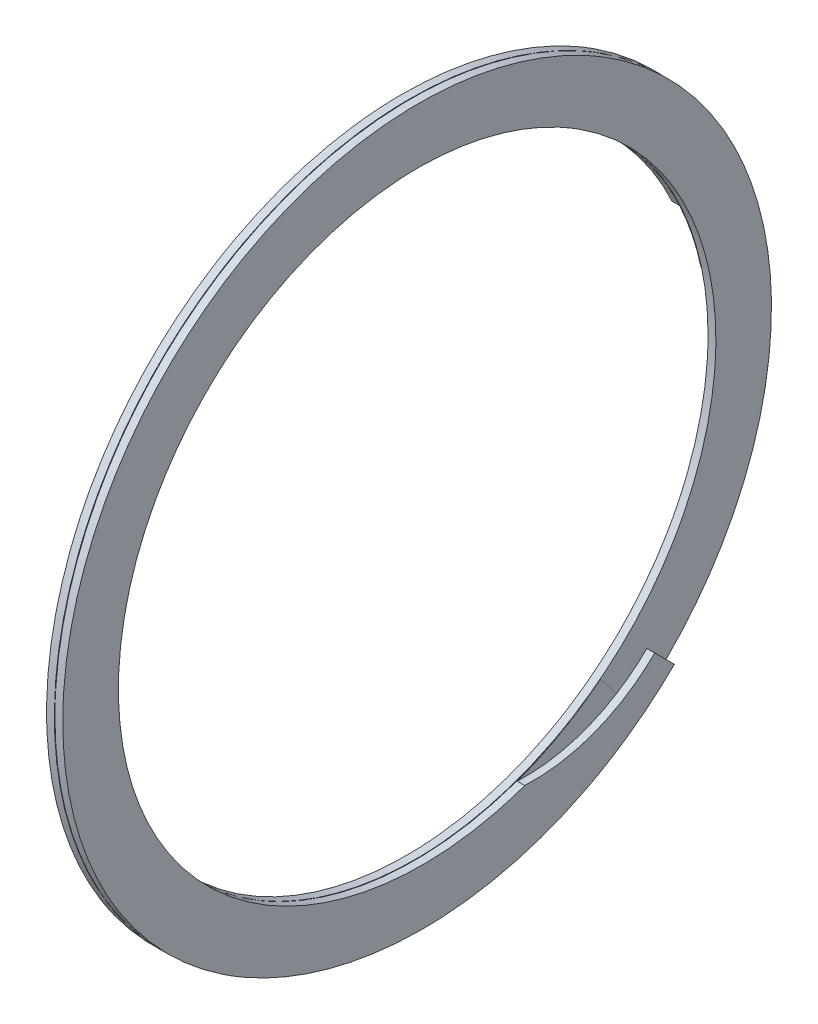
ISO-10303-21;
HEADER;
FILE_DESCRIPTION(('STEP AP214'),'2;1');
FILE_NAME('part.step','',(''),(''),'','','');
FILE_SCHEMA(('AUTOMOTIVE_DESIGN { 1 0 10303 214 1 1 1 1 }'));
ENDSEC;
DATA;
#1=APPLICATION_CONTEXT('core data for automotive mechanical design processes');
#2=APPLICATION_PROTOCOL_DEFINITION('international standard','automotive_design',2000,#1);
#3=PRODUCT_CONTEXT('',#1,'mechanical');
#4=PRODUCT('Part','Part','',(#3));
#5=PRODUCT_RELATED_PRODUCT_CATEGORY('part','',(#4));
#6=PRODUCT_DEFINITION_FORMATION('','',#4);
#7=PRODUCT_DEFINITION_CONTEXT('part definition',#1,'design');
#8=PRODUCT_DEFINITION('design','',#6,#7);
#9=PRODUCT_DEFINITION_SHAPE('','',#8);
#10=(LENGTH_UNIT() NAMED_UNIT(*) SI_UNIT(.MILLI.,.METRE.));
#11=(NAMED_UNIT(*) PLANE_ANGLE_UNIT() SI_UNIT($,.RADIAN.));
#12=(NAMED_UNIT(*) SI_UNIT($,.STERADIAN.) SOLID_ANGLE_UNIT());
#13=UNCERTAINTY_MEASURE_WITH_UNIT(LENGTH_MEASURE(1.E-05),#10,'distance_accuracy_value','');
#14=(GEOMETRIC_REPRESENTATION_CONTEXT(3) GLOBAL_UNCERTAINTY_ASSIGNED_CONTEXT((#13)) GLOBAL_UNIT_ASSIGNED_CONTEXT((#10,
#11,#12)) REPRESENTATION_CONTEXT('',''));
#15=CARTESIAN_POINT('',(0.,0.,0.));
#16=DIRECTION('',(0.,0.,1.));
#17=DIRECTION('',(1.,0.,0.));
#18=AXIS2_PLACEMENT_3D('',#15,#16,#17);
#19=CARTESIAN_POINT('',(0.423333333333334,0.,-16.2179));
#20=DIRECTION('',(0.,-1.,0.));
#21=DIRECTION('',(0.,0.,-1.));
#22=AXIS2_PLACEMENT_3D('',#19,#20,#21);
#23=PLANE('',#22);
#24=DIRECTION('',(0.,0.,-1.));
#25=VECTOR('',#24,1.);
#26=CARTESIAN_POINT('',(0.423333333333333,0.,-19.2151));
#27=LINE('',#26,#25);
#28=CARTESIAN_POINT('',(0.423333333333334,0.,-17.7165));
#29=VERTEX_POINT('',#28);
#30=CARTESIAN_POINT('',(0.423333333333333,0.,-19.2151));
#31=VERTEX_POINT('',#30);
#32=EDGE_CURVE('E275',#29,#31,#27,.T.);
#33=ORIENTED_EDGE('',*,*,#32,.F.);
#34=DIRECTION('',(-1.,0.,0.));
#35=VECTOR('',#34,1.);
#36=CARTESIAN_POINT('',(0.437444779966142,0.,-17.7165));
#37=LINE('',#36,#35);
#38=CARTESIAN_POINT('',(0.,0.,-17.7165));
#39=VERTEX_POINT('',#38);
#40=EDGE_CURVE('E193',#29,#39,#37,.T.);
#41=ORIENTED_EDGE('',*,*,#40,.T.);
#42=DIRECTION('',(0.,0.,1.));
#43=VECTOR('',#42,1.);
#44=CARTESIAN_POINT('',(0.,0.,-19.2151));
#45=LINE('',#44,#43);
#46=CARTESIAN_POINT('',(0.,0.,-19.2151));
#47=VERTEX_POINT('',#46);
#48=EDGE_CURVE('E272',#47,#39,#45,.T.);
#49=ORIENTED_EDGE('',*,*,#48,.F.);
#50=DIRECTION('',(-1.,0.,0.));
#51=VECTOR('',#50,1.);
#52=CARTESIAN_POINT('',(0.423333333333333,0.,-19.2151));
#53=LINE('',#52,#51);
#54=EDGE_CURVE('E289',#31,#47,#53,.T.);
#55=ORIENTED_EDGE('',*,*,#54,.F.);
#56=EDGE_LOOP('',(#33,#41,#49,#55));
#57=FACE_BOUND('',#56,.T.);
#58=ADVANCED_FACE('F39',(#57),#23,.T.);
#59=CARTESIAN_POINT('',(0.,0.,-19.2151));
#60=CARTESIAN_POINT('',(0.0376296296296295,11.0938431575056,-19.2151));
#61=CARTESIAN_POINT('',(0.0752592592592591,16.6407647362584,-9.60755));
#62=CARTESIAN_POINT('',(0.112888888888889,22.1876863150112,0.));
#63=CARTESIAN_POINT('',(0.150518518518518,16.6407647362584,9.60755));
#64=CARTESIAN_POINT('',(0.188148148148148,11.0938431575056,19.2151));
#65=CARTESIAN_POINT('',(0.225777777777777,0.,19.2151));
#66=CARTESIAN_POINT('',(0.263407407407407,-11.0938431575056,19.2151));
#67=CARTESIAN_POINT('',(0.301037037037036,-16.6407647362584,9.60755000000001));
#68=CARTESIAN_POINT('',(0.338666666666666,-22.1876863150112,0.));
#69=CARTESIAN_POINT('',(0.376296296296295,-16.6407647362584,-9.60754999999999));
#70=CARTESIAN_POINT('',(0.413925925925925,-11.0938431575056,-19.2151));
#71=CARTESIAN_POINT('',(0.451555555555555,0.,-19.2151));
#72=CARTESIAN_POINT('',(0.489185185185184,11.0938431575056,-19.2151));
#73=CARTESIAN_POINT('',(0.526814814814814,16.6407647362584,-9.60755));
#74=CARTESIAN_POINT('',(0.564444444444443,22.1876863150112,0.));
#75=CARTESIAN_POINT('',(0.602074074074073,16.6407647362584,9.60755));
#76=CARTESIAN_POINT('',(0.639703703703702,11.0938431575056,19.2151));
#77=CARTESIAN_POINT('',(0.677333333333332,0.,19.2151));
#78=CARTESIAN_POINT('',(0.714962962962961,-11.0938431575056,19.2151));
#79=CARTESIAN_POINT('',(0.752592592592591,-16.6407647362584,9.60755000000001));
#80=CARTESIAN_POINT('',(0.790222222222221,-22.1876863150112,0.));
#81=CARTESIAN_POINT('',(0.82785185185185,-16.6407647362584,-9.60754999999999));
#82=CARTESIAN_POINT('',(0.86548148148148,-11.0938431575056,-19.2151));
#83=CARTESIAN_POINT('',(0.903111111111109,0.,-19.2151));
#84=CARTESIAN_POINT('',(0.,0.,-16.2179));
#85=CARTESIAN_POINT('',(0.0376296296296295,9.36340893069043,-16.2179));
#86=CARTESIAN_POINT('',(0.0752592592592591,14.0451133960356,-8.10895));
#87=CARTESIAN_POINT('',(0.112888888888889,18.7268178613809,0.));
#88=CARTESIAN_POINT('',(0.150518518518518,14.0451133960356,8.10894999999999));
#89=CARTESIAN_POINT('',(0.188148148148148,9.36340893069044,16.2179));
#90=CARTESIAN_POINT('',(0.225777777777777,0.,16.2179));
#91=CARTESIAN_POINT('',(0.263407407407407,-9.36340893069042,16.2179));
#92=CARTESIAN_POINT('',(0.301037037037036,-14.0451133960356,8.10895000000001));
#93=CARTESIAN_POINT('',(0.338666666666666,-18.7268178613809,0.));
#94=CARTESIAN_POINT('',(0.376296296296295,-14.0451133960357,-8.10894999999999));
#95=CARTESIAN_POINT('',(0.413925925925925,-9.36340893069044,-16.2179));
#96=CARTESIAN_POINT('',(0.451555555555555,0.,-16.2179));
#97=CARTESIAN_POINT('',(0.489185185185184,9.36340893069043,-16.2179));
#98=CARTESIAN_POINT('',(0.526814814814814,14.0451133960356,-8.10895));
#99=CARTESIAN_POINT('',(0.564444444444443,18.7268178613809,0.));
#100=CARTESIAN_POINT('',(0.602074074074073,14.0451133960356,8.10894999999999));
#101=CARTESIAN_POINT('',(0.639703703703702,9.36340893069044,16.2179));
#102=CARTESIAN_POINT('',(0.677333333333332,0.,16.2179));
#103=CARTESIAN_POINT('',(0.714962962962961,-9.36340893069042,16.2179));
#104=CARTESIAN_POINT('',(0.752592592592591,-14.0451133960356,8.10895000000001));
#105=CARTESIAN_POINT('',(0.790222222222221,-18.7268178613809,0.));
#106=CARTESIAN_POINT('',(0.82785185185185,-14.0451133960357,-8.10894999999999));
#107=CARTESIAN_POINT('',(0.86548148148148,-9.36340893069044,-16.2179));
#108=CARTESIAN_POINT('',(0.903111111111109,0.,-16.2179));
#109=(BOUNDED_SURFACE() B_SPLINE_SURFACE(1,2,((#59,#60,#61,#62,#63,#64,#65,#66,#67,#68,#69,#70,
#71,#72,#73,#74,#75,#76,#77,#78,#79,#80,#81,#82,#83),(#84,#85,#86,#87,#88,#89,#90,#91,#92,#93,
#94,#95,#96,#97,#98,#99,#100,#101,#102,#103,#104,#105,#106,#107,#108)),.UNSPECIFIED.,.F.,.F.,
.F.) B_SPLINE_SURFACE_WITH_KNOTS((2,2),(3,2,2,2,2,2,2,2,2,2,2,2,3),(0.,1.),(0.,
0.0833333333333333,0.166666666666667,0.25,0.333333333333333,0.416666666666667,0.5,
0.583333333333333,0.666666666666667,0.75,0.833333333333333,0.916666666666667,1.),
.UNSPECIFIED.) GEOMETRIC_REPRESENTATION_ITEM() RATIONAL_B_SPLINE_SURFACE(((1.,0.866025403784439,
1.,0.866025403784439,1.,0.866025403784439,1.,0.866025403784439,1.,0.866025403784439,1.,
0.866025403784439,1.,0.866025403784439,1.,0.866025403784439,1.,0.866025403784439,1.,
0.866025403784439,1.,0.866025403784439,1.,0.866025403784439,1.),(1.,0.866025403784439,1.,
0.866025403784439,1.,0.866025403784439,1.,0.866025403784439,1.,0.866025403784439,1.,
0.866025403784439,1.,0.866025403784439,1.,0.866025403784439,1.,0.866025403784439,1.,
0.866025403784439,1.,0.866025403784439,1.,0.866025403784439,1.))) REPRESENTATION_ITEM('') SURFACE());
#110=CARTESIAN_POINT('',(0.846002954781843,-12.5274567862123,-12.5274577915705));
#111=CARTESIAN_POINT('',(0.845645095292089,-12.5891267223919,-12.4657883529428));
#112=CARTESIAN_POINT('',(0.845287943955112,-12.6499278812871,-12.403250169712));
#113=CARTESIAN_POINT('',(0.844575969344457,-12.7696042567872,-12.2766364372516));
#114=CARTESIAN_POINT('',(0.844221142566673,-12.8284836775949,-12.2125648618543));
#115=CARTESIAN_POINT('',(0.843513596701136,-12.9443283969132,-12.0828950856114));
#116=CARTESIAN_POINT('',(0.843160875176884,-13.0012965590127,-12.0172994430442));
#117=CARTESIAN_POINT('',(0.842457325935102,-13.1133266922086,-11.8845886721481));
#118=CARTESIAN_POINT('',(0.842106496943383,-13.1683901312167,-11.817474782984));
#119=CARTESIAN_POINT('',(0.841406522324876,-13.2766146758252,-11.6817303286152));
#120=CARTESIAN_POINT('',(0.84105737669809,-13.3297757814235,-11.613099763409));
#121=CARTESIAN_POINT('',(0.840360563315117,-13.4341951297367,-11.4743211316773));
#122=CARTESIAN_POINT('',(0.8400128969429,-13.48545183743,-11.4041719101637));
#123=CARTESIAN_POINT('',(0.839318843061387,-13.5860568556888,-11.2623519570958));
#124=CARTESIAN_POINT('',(0.838972458427607,-13.6354020343582,-11.1906790037916));
#125=CARTESIAN_POINT('',(0.838280772386356,-13.7321742471712,-11.0458044392397));
#126=CARTESIAN_POINT('',(0.837935475475736,-13.7795964707902,-10.9725996146416));
#127=CARTESIAN_POINT('',(0.837591167891047,-13.825978247133,-10.8987413649063));
#128=B_SPLINE_CURVE_WITH_KNOTS('',3,(#110,#111,#112,#113,#114,#115,#116,#117,#118,#119,#120,
#121,#122,#123,#124,#125,#126,#127),.UNSPECIFIED.,.F.,.F.,(4,2,2,2,2,2,2,2,4),(0.,
0.261635829936186,0.522654579689194,0.783262994303639,1.04366587627582,1.30406875852038,
1.56467717318963,1.82569592296043,2.08733175327831),.UNSPECIFIED.);
#129=CARTESIAN_POINT('',(0.846334810724255,-12.5274567862123,-12.5274577915705));
#130=VERTEX_POINT('',#129);
#131=CARTESIAN_POINT('',(0.837591167891048,-13.8259782471328,-10.8987413649066));
#132=VERTEX_POINT('',#131);
#133=EDGE_CURVE('E119',#130,#132,#128,.T.);
#134=DIRECTION('',(0.,0.70710678118653,0.707106781186565));
#135=VECTOR('',#134,1.);
#136=CARTESIAN_POINT('',(0.846666666666667,-13.5871275111773,-13.587127511178));
#137=LINE('',#136,#135);
#138=CARTESIAN_POINT('',(0.846333292516527,-13.5871269933225,-13.5871280290327));
#139=VERTEX_POINT('',#138);
#140=EDGE_CURVE('E42',#139,#130,#137,.T.);
#141=CARTESIAN_POINT('',(0.,0.,-19.2151));
#142=CARTESIAN_POINT('',(0.0376296296296295,11.0938431575056,-19.2151));
#143=CARTESIAN_POINT('',(0.0752592592592591,16.6407647362584,-9.60755));
#144=CARTESIAN_POINT('',(0.112888888888889,22.1876863150112,0.));
#145=CARTESIAN_POINT('',(0.150518518518518,16.6407647362584,9.60755));
#146=CARTESIAN_POINT('',(0.188148148148148,11.0938431575056,19.2151));
#147=CARTESIAN_POINT('',(0.225777777777777,0.,19.2151));
#148=CARTESIAN_POINT('',(0.263407407407407,-11.0938431575056,19.2151));
#149=CARTESIAN_POINT('',(0.301037037037036,-16.6407647362584,9.60755000000001));
#150=CARTESIAN_POINT('',(0.338666666666666,-22.1876863150112,0.));
#151=CARTESIAN_POINT('',(0.376296296296295,-16.6407647362584,-9.60754999999999));
#152=CARTESIAN_POINT('',(0.413925925925925,-11.0938431575056,-19.2151));
#153=CARTESIAN_POINT('',(0.451555555555555,0.,-19.2151));
#154=CARTESIAN_POINT('',(0.489185185185184,11.0938431575056,-19.2151));
#155=CARTESIAN_POINT('',(0.526814814814814,16.6407647362584,-9.60755000000001));
#156=CARTESIAN_POINT('',(0.564444444444443,22.1876863150112,0.));
#157=CARTESIAN_POINT('',(0.602074074074073,16.6407647362584,9.60754999999998));
#158=CARTESIAN_POINT('',(0.639703703703702,11.0938431575056,19.2151));
#159=CARTESIAN_POINT('',(0.677333333333332,0.,19.2151));
#160=CARTESIAN_POINT('',(0.714962962962961,-11.0938431575056,19.2151));
#161=CARTESIAN_POINT('',(0.752592592592591,-16.6407647362584,9.60755000000002));
#162=CARTESIAN_POINT('',(0.790222222222221,-22.1876863150112,0.));
#163=CARTESIAN_POINT('',(0.82785185185185,-16.6407647362584,-9.60754999999998));
#164=CARTESIAN_POINT('',(0.86548148148148,-11.0938431575056,-19.2151));
#165=CARTESIAN_POINT('',(0.903111111111109,0.,-19.2151));
#166=(BOUNDED_CURVE() B_SPLINE_CURVE(2,(#141,#142,#143,#144,#145,#146,#147,#148,#149,#150,#151,
#152,#153,#154,#155,#156,#157,#158,#159,#160,#161,#162,#163,#164,#165),.UNSPECIFIED.,.F.,
.F.) B_SPLINE_CURVE_WITH_KNOTS((3,2,2,2,2,2,2,2,2,2,2,2,3),(0.,0.0833333333333333,
0.166666666666667,0.25,0.333333333333333,0.416666666666667,0.5,0.583333333333333,
0.666666666666667,0.75,0.833333333333333,0.916666666666667,1.),
.UNSPECIFIED.) CURVE() GEOMETRIC_REPRESENTATION_ITEM() RATIONAL_B_SPLINE_CURVE((1.,
0.866025403784439,1.,0.866025403784439,1.,0.866025403784439,1.,0.866025403784439,1.,
0.866025403784439,1.,0.866025403784439,1.,0.866025403784439,1.,0.866025403784439,1.,
0.866025403784439,1.,0.866025403784439,1.,0.866025403784439,1.,0.866025403784439,1.)) REPRESENTATION_ITEM(''));
#167=EDGE_CURVE('E260',#47,#139,#166,.T.);
#168=CARTESIAN_POINT('',(0.,0.,-17.7165));
#169=CARTESIAN_POINT('',(0.000960948235595211,0.261212294958431,-17.7165280297711));
#170=CARTESIAN_POINT('',(0.001934176793897,0.522420409435114,-17.7054861128376));
#171=CARTESIAN_POINT('',(0.00390341583842167,1.04297689994611,-17.6614643024078));
#172=CARTESIAN_POINT('',(0.00489942588436842,1.3023253117941,-17.6284848325324));
#173=CARTESIAN_POINT('',(0.00691267015815235,1.81736825173818,-17.5407818149937));
#174=CARTESIAN_POINT('',(0.00792990822690146,2.07306210424179,-17.4860542994346));
#175=CARTESIAN_POINT('',(0.00998359627186939,2.57891943024737,-17.3552560239966));
#176=CARTESIAN_POINT('',(0.0110200454411025,2.8290831350864,-17.2791861587403));
#177=CARTESIAN_POINT('',(0.0131111439210773,3.32229170495841,-17.1061778439433));
#178=CARTESIAN_POINT('',(0.0141658059201964,3.56533126028363,-17.0092242573424));
#179=CARTESIAN_POINT('',(0.0162907596152201,4.04237105376712,-16.7951720362177));
#180=CARTESIAN_POINT('',(0.0173610512888844,4.27637130478623,-16.6780734303569));
#181=CARTESIAN_POINT('',(0.0195139328380306,4.73335204731324,-16.4247391785647));
#182=CARTESIAN_POINT('',(0.0205965038964817,4.95634716920404,-16.288529918621));
#183=CARTESIAN_POINT('',(0.0227731375329584,5.38999878517241,-15.9978737583607));
#184=CARTESIAN_POINT('',(0.023867195511848,5.6006600108181,-15.8434339212086));
#185=CARTESIAN_POINT('',(0.0259767683282243,5.99181295181141,-15.5305082422638));
#186=CARTESIAN_POINT('',(0.026991515131713,6.17336813739612,-15.3733492051444));
#187=CARTESIAN_POINT('',(0.0290266903732213,6.52355065897665,-15.0456817978995));
#188=CARTESIAN_POINT('',(0.0300471094852238,6.69219482991541,-14.8751914184126));
#189=CARTESIAN_POINT('',(0.0310703529902498,6.85398070708439,-14.6984090593817));
#190=B_SPLINE_CURVE_WITH_KNOTS('',3,(#168,#169,#170,#171,#172,#173,#174,#175,#176,#177,#178,
#179,#180,#181,#182,#183,#184,#185,#186,#187,#188,#189),.UNSPECIFIED.,.F.,.F.,(4,2,2,2,2,2,2,2,
2,2,4),(0.,0.783403017765985,1.56679090821855,2.35032179220072,3.13381983726836,
3.91788770451081,4.70195445616574,5.48494911321449,6.26764140025923,6.98731903865659,
7.70604169996621),.UNSPECIFIED.);
#191=CARTESIAN_POINT('',(0.0310703529902498,6.8539807070844,-14.6984090593817));
#192=VERTEX_POINT('',#191);
#193=EDGE_CURVE('E191',#39,#192,#190,.T.);
#194=CARTESIAN_POINT('',(0.,0.,-16.2179));
#195=CARTESIAN_POINT('',(0.0376296296296295,9.36340893069043,-16.2179));
#196=CARTESIAN_POINT('',(0.0752592592592591,14.0451133960356,-8.10895));
#197=CARTESIAN_POINT('',(0.112888888888889,18.7268178613809,0.));
#198=CARTESIAN_POINT('',(0.150518518518518,14.0451133960356,8.10894999999999));
#199=CARTESIAN_POINT('',(0.188148148148148,9.36340893069044,16.2179));
#200=CARTESIAN_POINT('',(0.225777777777777,0.,16.2179));
#201=CARTESIAN_POINT('',(0.263407407407407,-9.36340893069042,16.2179));
#202=CARTESIAN_POINT('',(0.301037037037036,-14.0451133960356,8.10895000000001));
#203=CARTESIAN_POINT('',(0.338666666666666,-18.7268178613809,0.));
#204=CARTESIAN_POINT('',(0.376296296296295,-14.0451133960357,-8.10894999999999));
#205=CARTESIAN_POINT('',(0.413925925925925,-9.36340893069044,-16.2179));
#206=CARTESIAN_POINT('',(0.451555555555555,0.,-16.2179));
#207=CARTESIAN_POINT('',(0.489185185185184,9.36340893069042,-16.2179));
#208=CARTESIAN_POINT('',(0.526814814814814,14.0451133960356,-8.10895000000001));
#209=CARTESIAN_POINT('',(0.564444444444443,18.7268178613809,0.));
#210=CARTESIAN_POINT('',(0.602074074074073,14.0451133960357,8.10894999999999));
#211=CARTESIAN_POINT('',(0.639703703703702,9.36340893069046,16.2179));
#212=CARTESIAN_POINT('',(0.677333333333332,0.,16.2179));
#213=CARTESIAN_POINT('',(0.714962962962961,-9.36340893069041,16.2179));
#214=CARTESIAN_POINT('',(0.752592592592591,-14.0451133960356,8.10895000000002));
#215=CARTESIAN_POINT('',(0.790222222222221,-18.7268178613809,0.));
#216=CARTESIAN_POINT('',(0.82785185185185,-14.0451133960357,-8.10894999999998));
#217=CARTESIAN_POINT('',(0.86548148148148,-9.36340893069046,-16.2179));
#218=CARTESIAN_POINT('',(0.903111111111109,0.,-16.2179));
#219=(BOUNDED_CURVE() B_SPLINE_CURVE(2,(#194,#195,#196,#197,#198,#199,#200,#201,#202,#203,#204,
#205,#206,#207,#208,#209,#210,#211,#212,#213,#214,#215,#216,#217,#218),.UNSPECIFIED.,.F.,
.F.) B_SPLINE_CURVE_WITH_KNOTS((3,2,2,2,2,2,2,2,2,2,2,2,3),(0.,0.0833333333333333,
0.166666666666667,0.25,0.333333333333333,0.416666666666667,0.5,0.583333333333333,
0.666666666666667,0.75,0.833333333333333,0.916666666666667,1.),
.UNSPECIFIED.) CURVE() GEOMETRIC_REPRESENTATION_ITEM() RATIONAL_B_SPLINE_CURVE((1.,
0.866025403784439,1.,0.866025403784439,1.,0.866025403784439,1.,0.866025403784439,1.,
0.866025403784439,1.,0.866025403784439,1.,0.866025403784439,1.,0.866025403784439,1.,
0.866025403784439,1.,0.866025403784439,1.,0.866025403784439,1.,0.866025403784439,1.)) REPRESENTATION_ITEM(''));
#220=CARTESIAN_POINT('',(0.837591167891048,-12.736541250171,-10.039960029437));
#221=VERTEX_POINT('',#220);
#222=EDGE_CURVE('E267',#192,#221,#219,.T.);
#223=CARTESIAN_POINT('',(0.837591167891049,-15.0903578007116,-11.895426409192));
#224=CARTESIAN_POINT('',(0.837591167891048,-14.863861697532,-11.7168840735547));
#225=CARTESIAN_POINT('',(0.837591167891048,-14.6373655943524,-11.5383417379174));
#226=CARTESIAN_POINT('',(0.837591167891048,-14.1843733879932,-11.1812570666427));
#227=CARTESIAN_POINT('',(0.837591167891048,-13.9578772848136,-11.0027147310054));
#228=CARTESIAN_POINT('',(0.837591167891048,-13.3997678711463,-10.5627682733911));
#229=CARTESIAN_POINT('',(0.837591167891048,-13.0681545606587,-10.301364151414));
#230=CARTESIAN_POINT('',(0.837591167891048,-12.736541250171,-10.039960029437));
#231=B_SPLINE_CURVE_WITH_KNOTS('',3,(#223,#224,#225,#226,#227,#228,#229,#230),.UNSPECIFIED.,.F.,
.F.,(4,2,2,4),(0.,0.865217113407573,1.73043422681515,2.9972),.UNSPECIFIED.);
#232=EDGE_CURVE('E110',#132,#221,#231,.T.);
#233=ORIENTED_EDGE('',*,*,#133,.F.);
#234=ORIENTED_EDGE('',*,*,#140,.F.);
#235=ORIENTED_EDGE('',*,*,#167,.F.);
#236=ORIENTED_EDGE('',*,*,#48,.T.);
#237=ORIENTED_EDGE('',*,*,#193,.T.);
#238=ORIENTED_EDGE('',*,*,#222,.T.);
#239=ORIENTED_EDGE('',*,*,#232,.F.);
#240=EDGE_LOOP('',(#233,#234,#235,#236,#237,#238,#239));
#241=FACE_BOUND('',#240,.T.);
#242=ADVANCED_FACE('F162',(#241),#109,.T.);
#243=CARTESIAN_POINT('',(0.,0.,0.));
#244=DIRECTION('',(1.,0.,0.));
#245=DIRECTION('',(0.,0.,-1.));
#246=AXIS2_PLACEMENT_3D('',#243,#244,#245);
#247=CYLINDRICAL_SURFACE('',#246,16.2179);
#248=DIRECTION('',(1.,0.,0.));
#249=VECTOR('',#248,1.);
#250=CARTESIAN_POINT('',(0.837591167891048,-15.2398407188435,-5.54684913029716));
#251=LINE('',#250,#249);
#252=CARTESIAN_POINT('',(0.837591167891048,-15.2398407188435,-5.54684913029716));
#253=VERTEX_POINT('',#252);
#254=CARTESIAN_POINT('',(1.23929574120037,-15.2398407188435,-5.54684913029716));
#255=VERTEX_POINT('',#254);
#256=EDGE_CURVE('E115',#253,#255,#251,.T.);
#257=ORIENTED_EDGE('',*,*,#256,.F.);
#258=CARTESIAN_POINT('',(0.837591167891048,0.,0.));
#259=DIRECTION('',(-1.,0.,0.));
#260=DIRECTION('',(0.,0.,1.));
#261=AXIS2_PLACEMENT_3D('',#258,#259,#260);
#262=CIRCLE('',#261,16.2179);
#263=EDGE_CURVE('E105',#221,#253,#262,.T.);
#264=ORIENTED_EDGE('',*,*,#263,.F.);
#265=ORIENTED_EDGE('',*,*,#222,.F.);
#266=DIRECTION('',(-1.,0.,0.));
#267=VECTOR('',#266,1.);
#268=CARTESIAN_POINT('',(0.437444779966142,6.8539807070844,-14.6984090593817));
#269=LINE('',#268,#267);
#270=CARTESIAN_POINT('',(0.437444779966142,6.8539807070844,-14.6984090593817));
#271=VERTEX_POINT('',#270);
#272=EDGE_CURVE('E196',#271,#192,#269,.T.);
#273=ORIENTED_EDGE('',*,*,#272,.F.);
#274=CARTESIAN_POINT('',(0.437444779966142,0.,0.));
#275=DIRECTION('',(-1.,0.,0.));
#276=DIRECTION('',(0.,0.,-1.));
#277=AXIS2_PLACEMENT_3D('',#274,#275,#276);
#278=CIRCLE('',#277,16.2179);
#279=CARTESIAN_POINT('',(0.437444779966142,3.31381218936706,-15.8757339730673));
#280=VERTEX_POINT('',#279);
#281=EDGE_CURVE('E197',#271,#280,#278,.T.);
#282=ORIENTED_EDGE('',*,*,#281,.T.);
#283=CARTESIAN_POINT('',(0.423333333333334,0.,-16.2179));
#284=CARTESIAN_POINT('',(0.460962962962963,9.36340893069043,-16.2179));
#285=CARTESIAN_POINT('',(0.498592592592593,14.0451133960356,-8.10895));
#286=CARTESIAN_POINT('',(0.536222222222222,18.7268178613809,0.));
#287=CARTESIAN_POINT('',(0.573851851851852,14.0451133960356,8.10894999999999));
#288=CARTESIAN_POINT('',(0.611481481481482,9.36340893069044,16.2179));
#289=CARTESIAN_POINT('',(0.649111111111111,0.,16.2179));
#290=CARTESIAN_POINT('',(0.686740740740741,-9.36340893069042,16.2179));
#291=CARTESIAN_POINT('',(0.72437037037037,-14.0451133960356,8.10895000000001));
#292=CARTESIAN_POINT('',(0.762,-18.7268178613809,0.));
#293=CARTESIAN_POINT('',(0.799629629629629,-14.0451133960357,-8.10894999999999));
#294=CARTESIAN_POINT('',(0.837259259259259,-9.36340893069044,-16.2179));
#295=CARTESIAN_POINT('',(0.874888888888888,0.,-16.2179));
#296=CARTESIAN_POINT('',(0.912518518518518,9.36340893069042,-16.2179));
#297=CARTESIAN_POINT('',(0.950148148148147,14.0451133960356,-8.10895000000001));
#298=CARTESIAN_POINT('',(0.987777777777777,18.7268178613809,0.));
#299=CARTESIAN_POINT('',(1.02540740740741,14.0451133960357,8.10894999999999));
#300=CARTESIAN_POINT('',(1.06303703703704,9.36340893069046,16.2179));
#301=CARTESIAN_POINT('',(1.10066666666667,0.,16.2179));
#302=CARTESIAN_POINT('',(1.1382962962963,-9.36340893069041,16.2179));
#303=CARTESIAN_POINT('',(1.17592592592592,-14.0451133960356,8.10895000000002));
#304=CARTESIAN_POINT('',(1.21355555555555,-18.7268178613809,0.));
#305=CARTESIAN_POINT('',(1.25118518518518,-14.0451133960357,-8.10894999999998));
#306=CARTESIAN_POINT('',(1.28881481481481,-9.36340893069046,-16.2179));
#307=CARTESIAN_POINT('',(1.32644444444444,0.,-16.2179));
#308=(BOUNDED_CURVE() B_SPLINE_CURVE(2,(#283,#284,#285,#286,#287,#288,#289,#290,#291,#292,#293,
#294,#295,#296,#297,#298,#299,#300,#301,#302,#303,#304,#305,#306,#307),.UNSPECIFIED.,.F.,
.F.) B_SPLINE_CURVE_WITH_KNOTS((3,2,2,2,2,2,2,2,2,2,2,2,3),(0.,0.0833333333333333,
0.166666666666667,0.25,0.333333333333333,0.416666666666667,0.5,0.583333333333333,
0.666666666666667,0.75,0.833333333333333,0.916666666666667,1.),
.UNSPECIFIED.) CURVE() GEOMETRIC_REPRESENTATION_ITEM() RATIONAL_B_SPLINE_CURVE((1.,
0.866025403784439,1.,0.866025403784439,1.,0.866025403784439,1.,0.866025403784439,1.,
0.866025403784439,1.,0.866025403784439,1.,0.866025403784439,1.,0.866025403784439,1.,
0.866025403784439,1.,0.866025403784439,1.,0.866025403784439,1.,0.866025403784439,1.)) REPRESENTATION_ITEM(''));
#309=EDGE_CURVE('E125',#280,#255,#308,.T.);
#310=ORIENTED_EDGE('',*,*,#309,.T.);
#311=EDGE_LOOP('',(#257,#264,#265,#273,#282,#310));
#312=FACE_BOUND('',#311,.T.);
#313=ADVANCED_FACE('F122',(#312),#247,.F.);
#314=CARTESIAN_POINT('',(0.423333333333334,0.,-16.2179));
#315=CARTESIAN_POINT('',(0.460962962962963,9.36340893069043,-16.2179));
#316=CARTESIAN_POINT('',(0.498592592592593,14.0451133960356,-8.10895));
#317=CARTESIAN_POINT('',(0.536222222222222,18.7268178613809,0.));
#318=CARTESIAN_POINT('',(0.573851851851852,14.0451133960356,8.10894999999999));
#319=CARTESIAN_POINT('',(0.611481481481482,9.36340893069044,16.2179));
#320=CARTESIAN_POINT('',(0.649111111111111,0.,16.2179));
#321=CARTESIAN_POINT('',(0.686740740740741,-9.36340893069042,16.2179));
#322=CARTESIAN_POINT('',(0.72437037037037,-14.0451133960356,8.10895000000001));
#323=CARTESIAN_POINT('',(0.762,-18.7268178613809,0.));
#324=CARTESIAN_POINT('',(0.799629629629629,-14.0451133960357,-8.10894999999999));
#325=CARTESIAN_POINT('',(0.837259259259259,-9.36340893069044,-16.2179));
#326=CARTESIAN_POINT('',(0.874888888888888,0.,-16.2179));
#327=CARTESIAN_POINT('',(0.912518518518518,9.36340893069043,-16.2179));
#328=CARTESIAN_POINT('',(0.950148148148147,14.0451133960356,-8.10895));
#329=CARTESIAN_POINT('',(0.987777777777777,18.7268178613809,0.));
#330=CARTESIAN_POINT('',(1.02540740740741,14.0451133960356,8.10894999999999));
#331=CARTESIAN_POINT('',(1.06303703703704,9.36340893069044,16.2179));
#332=CARTESIAN_POINT('',(1.10066666666667,0.,16.2179));
#333=CARTESIAN_POINT('',(1.1382962962963,-9.36340893069042,16.2179));
#334=CARTESIAN_POINT('',(1.17592592592592,-14.0451133960356,8.10895000000001));
#335=CARTESIAN_POINT('',(1.21355555555555,-18.7268178613809,0.));
#336=CARTESIAN_POINT('',(1.25118518518518,-14.0451133960357,-8.10894999999999));
#337=CARTESIAN_POINT('',(1.28881481481481,-9.36340893069044,-16.2179));
#338=CARTESIAN_POINT('',(1.32644444444444,0.,-16.2179));
#339=CARTESIAN_POINT('',(0.423333333333333,0.,-19.2151));
#340=CARTESIAN_POINT('',(0.460962962962963,11.0938431575056,-19.2151));
#341=CARTESIAN_POINT('',(0.498592592592592,16.6407647362584,-9.60755));
#342=CARTESIAN_POINT('',(0.536222222222222,22.1876863150112,0.));
#343=CARTESIAN_POINT('',(0.573851851851852,16.6407647362584,9.60755));
#344=CARTESIAN_POINT('',(0.611481481481481,11.0938431575056,19.2151));
#345=CARTESIAN_POINT('',(0.649111111111111,0.,19.2151));
#346=CARTESIAN_POINT('',(0.68674074074074,-11.0938431575056,19.2151));
#347=CARTESIAN_POINT('',(0.72437037037037,-16.6407647362584,9.60755000000001));
#348=CARTESIAN_POINT('',(0.761999999999999,-22.1876863150112,0.));
#349=CARTESIAN_POINT('',(0.799629629629629,-16.6407647362584,-9.60754999999999));
#350=CARTESIAN_POINT('',(0.837259259259258,-11.0938431575056,-19.2151));
#351=CARTESIAN_POINT('',(0.874888888888888,0.,-19.2151));
#352=CARTESIAN_POINT('',(0.912518518518518,11.0938431575056,-19.2151));
#353=CARTESIAN_POINT('',(0.950148148148147,16.6407647362584,-9.60755));
#354=CARTESIAN_POINT('',(0.987777777777777,22.1876863150112,0.));
#355=CARTESIAN_POINT('',(1.02540740740741,16.6407647362584,9.60755));
#356=CARTESIAN_POINT('',(1.06303703703704,11.0938431575056,19.2151));
#357=CARTESIAN_POINT('',(1.10066666666667,0.,19.2151));
#358=CARTESIAN_POINT('',(1.13829629629629,-11.0938431575056,19.2151));
#359=CARTESIAN_POINT('',(1.17592592592592,-16.6407647362584,9.60755000000001));
#360=CARTESIAN_POINT('',(1.21355555555555,-22.1876863150112,0.));
#361=CARTESIAN_POINT('',(1.25118518518518,-16.6407647362584,-9.60754999999999));
#362=CARTESIAN_POINT('',(1.28881481481481,-11.0938431575056,-19.2151));
#363=CARTESIAN_POINT('',(1.32644444444444,0.,-19.2151));
#364=(BOUNDED_SURFACE() B_SPLINE_SURFACE(1,2,((#314,#315,#316,#317,#318,#319,#320,#321,#322,
#323,#324,#325,#326,#327,#328,#329,#330,#331,#332,#333,#334,#335,#336,#337,#338),(#339,#340,
#341,#342,#343,#344,#345,#346,#347,#348,#349,#350,#351,#352,#353,#354,#355,#356,#357,#358,#359,
#360,#361,#362,#363)),.UNSPECIFIED.,.F.,.F.,.F.) B_SPLINE_SURFACE_WITH_KNOTS((2,2),(3,2,2,2,2,2,
2,2,2,2,2,2,3),(0.,1.),(0.,0.0833333333333333,0.166666666666667,0.25,0.333333333333333,
0.416666666666667,0.5,0.583333333333333,0.666666666666667,0.75,0.833333333333333,
0.916666666666667,1.),
.UNSPECIFIED.) GEOMETRIC_REPRESENTATION_ITEM() RATIONAL_B_SPLINE_SURFACE(((1.,0.866025403784439,
1.,0.866025403784439,1.,0.866025403784439,1.,0.866025403784439,1.,0.866025403784439,1.,
0.866025403784439,1.,0.866025403784439,1.,0.866025403784439,1.,0.866025403784439,1.,
0.866025403784439,1.,0.866025403784439,1.,0.866025403784439,1.),(1.,0.866025403784439,1.,
0.866025403784439,1.,0.866025403784439,1.,0.866025403784439,1.,0.866025403784439,1.,
0.866025403784439,1.,0.866025403784439,1.,0.866025403784439,1.,0.866025403784439,1.,
0.866025403784439,1.,0.866025403784439,1.,0.866025403784439,1.))) REPRESENTATION_ITEM('') SURFACE());
#365=CARTESIAN_POINT('',(1.23929574120037,-15.2398407188435,-5.54684913029715));
#366=CARTESIAN_POINT('',(1.24034850887431,-15.2514072571024,-5.80780520878767));
#367=CARTESIAN_POINT('',(1.24139065303262,-15.2519144721877,-6.06924619415154));
#368=CARTESIAN_POINT('',(1.2434540177266,-15.2309301547459,-6.5912394780298));
#369=CARTESIAN_POINT('',(1.24447523866563,-15.2094390467215,-6.85179179359556));
#370=CARTESIAN_POINT('',(1.24649730549453,-15.1445724983305,-7.37020676916594));
#371=CARTESIAN_POINT('',(1.24749814763061,-15.1011930633879,-7.62806892945208));
#372=CARTESIAN_POINT('',(1.24946755753851,-14.9928673618142,-8.13921123232894));
#373=CARTESIAN_POINT('',(1.25043612666149,-14.9279219993125,-8.39249156653871));
#374=CARTESIAN_POINT('',(1.25237905586385,-14.7768685625444,-8.89286190213473));
#375=CARTESIAN_POINT('',(1.25335341963771,-14.6907451547797,-9.13994727472053));
#376=CARTESIAN_POINT('',(1.25532887526369,-14.4979736223164,-9.62597732460608));
#377=CARTESIAN_POINT('',(1.25632996707775,-14.3913255268483,-9.8649220134989));
#378=CARTESIAN_POINT('',(1.25834938482025,-14.1584241691317,-10.3326476649148));
#379=CARTESIAN_POINT('',(1.25936768531093,-14.0321979144099,-10.5614420785488));
#380=CARTESIAN_POINT('',(1.2614223153009,-13.7609805089301,-11.007509872638));
#381=CARTESIAN_POINT('',(1.26245863768603,-13.6159966234922,-11.224787668085));
#382=CARTESIAN_POINT('',(1.26446319371672,-13.3206550678389,-11.6293805730438));
#383=CARTESIAN_POINT('',(1.26543019127898,-13.1716699839379,-11.8176995830482));
#384=CARTESIAN_POINT('',(1.26737509219084,-12.8597926206719,-12.1820121757168));
#385=CARTESIAN_POINT('',(1.26835297936682,-12.6969190572671,-12.3580217815811));
#386=CARTESIAN_POINT('',(1.26933628811518,-12.5274567862123,-12.5274577915705));
#387=B_SPLINE_CURVE_WITH_KNOTS('',3,(#365,#366,#367,#368,#369,#370,#371,#372,#373,#374,#375,
#376,#377,#378,#379,#380,#381,#382,#383,#384,#385,#386),.UNSPECIFIED.,.F.,.F.,(4,2,2,2,2,2,2,2,
2,2,4),(0.,0.78340405957441,1.56679300204339,2.35032496316227,3.13382407965355,3.91789215040873,
4.70195910453336,5.48495392499976,6.26764637401147,6.98731941281803,7.70603750791253),.UNSPECIFIED.);
#388=CARTESIAN_POINT('',(1.26966814734882,-12.5274569730546,-12.5274586100854));
#389=VERTEX_POINT('',#388);
#390=EDGE_CURVE('E56',#255,#389,#387,.T.);
#391=CARTESIAN_POINT('',(0.437444779966142,3.70182330290419,-17.7346085456437));
#392=CARTESIAN_POINT('',(0.437444779966142,3.63715478398133,-17.424796116881));
#393=CARTESIAN_POINT('',(0.437444779966142,3.57248626505847,-17.1149836881182));
#394=CARTESIAN_POINT('',(0.437444779966142,3.44314922721276,-16.4953588305927));
#395=CARTESIAN_POINT('',(0.437444779966142,3.37848070828991,-16.18554640183));
#396=CARTESIAN_POINT('',(0.437444779966142,3.31381218936706,-15.8757339730673));
#397=B_SPLINE_CURVE_WITH_KNOTS('',3,(#391,#392,#393,#394,#395,#396),.UNSPECIFIED.,.F.,.F.,(4,2,
4),(0.,0.949469233414067,1.89893846682813),.UNSPECIFIED.);
#398=CARTESIAN_POINT('',(0.437444779966142,3.55083389712875,-17.0112520299868));
#399=VERTEX_POINT('',#398);
#400=EDGE_CURVE('E239',#399,#280,#397,.T.);
#401=CARTESIAN_POINT('',(0.437444779966142,3.55083389712876,-17.0112520299868));
#402=CARTESIAN_POINT('',(0.436380301589768,3.30751743552926,-17.1119070364279));
#403=CARTESIAN_POINT('',(0.435324055700052,3.05989772147764,-17.2021646000734));
#404=CARTESIAN_POINT('',(0.433229528066674,2.55779552294183,-17.3613849637402));
#405=CARTESIAN_POINT('',(0.432191253585623,2.30331036559876,-17.430339336006));
#406=CARTESIAN_POINT('',(0.43015166069731,1.79357699446116,-17.5454335782569));
#407=CARTESIAN_POINT('',(0.429150016108996,1.53840786804052,-17.5919248068892));
#408=CARTESIAN_POINT('',(0.427168401970185,1.02516315442429,-17.6634026788565));
#409=CARTESIAN_POINT('',(0.426188421538366,0.767089129329096,-17.6884003684449));
#410=CARTESIAN_POINT('',(0.424903192611925,0.423818796637222,-17.7072172186845));
#411=CARTESIAN_POINT('',(0.424587384079001,0.339076437507328,-17.7106985980078));
#412=CARTESIAN_POINT('',(0.423958409395808,0.169559044883513,-17.7153392563756));
#413=CARTESIAN_POINT('',(0.423645242324654,0.084784034546369,-17.7164993810703));
#414=CARTESIAN_POINT('',(0.423333333333334,0.,-17.7165));
#415=B_SPLINE_CURVE_WITH_KNOTS('',3,(#401,#402,#403,#404,#405,#406,#407,#408,#409,#410,#411,
#412,#413,#414),.UNSPECIFIED.,.F.,.F.,(4,2,2,2,2,2,4),(0.,0.789718697536965,1.57974941680583,
2.35698700888856,3.133824913241,3.38824546800199,3.64257331858033),.UNSPECIFIED.);
#416=EDGE_CURVE('E48',#399,#29,#415,.T.);
#417=CARTESIAN_POINT('',(0.423333333333333,0.,-19.2151));
#418=CARTESIAN_POINT('',(0.460962962962963,11.0938431575056,-19.2151));
#419=CARTESIAN_POINT('',(0.498592592592592,16.6407647362584,-9.60755));
#420=CARTESIAN_POINT('',(0.536222222222222,22.1876863150112,0.));
#421=CARTESIAN_POINT('',(0.573851851851852,16.6407647362584,9.60755));
#422=CARTESIAN_POINT('',(0.611481481481481,11.0938431575056,19.2151));
#423=CARTESIAN_POINT('',(0.649111111111111,0.,19.2151));
#424=CARTESIAN_POINT('',(0.68674074074074,-11.0938431575056,19.2151));
#425=CARTESIAN_POINT('',(0.72437037037037,-16.6407647362584,9.60755000000001));
#426=CARTESIAN_POINT('',(0.761999999999999,-22.1876863150112,0.));
#427=CARTESIAN_POINT('',(0.799629629629629,-16.6407647362584,-9.60754999999999));
#428=CARTESIAN_POINT('',(0.837259259259258,-11.0938431575056,-19.2151));
#429=CARTESIAN_POINT('',(0.874888888888888,0.,-19.2151));
#430=CARTESIAN_POINT('',(0.912518518518518,11.0938431575056,-19.2151));
#431=CARTESIAN_POINT('',(0.950148148148147,16.6407647362584,-9.60755000000001));
#432=CARTESIAN_POINT('',(0.987777777777777,22.1876863150112,0.));
#433=CARTESIAN_POINT('',(1.02540740740741,16.6407647362584,9.60754999999998));
#434=CARTESIAN_POINT('',(1.06303703703704,11.0938431575056,19.2151));
#435=CARTESIAN_POINT('',(1.10066666666667,0.,19.2151));
#436=CARTESIAN_POINT('',(1.13829629629629,-11.0938431575056,19.2151));
#437=CARTESIAN_POINT('',(1.17592592592592,-16.6407647362584,9.60755000000002));
#438=CARTESIAN_POINT('',(1.21355555555555,-22.1876863150112,0.));
#439=CARTESIAN_POINT('',(1.25118518518518,-16.6407647362584,-9.60754999999998));
#440=CARTESIAN_POINT('',(1.28881481481481,-11.0938431575056,-19.2151));
#441=CARTESIAN_POINT('',(1.32644444444444,0.,-19.2151));
#442=(BOUNDED_CURVE() B_SPLINE_CURVE(2,(#417,#418,#419,#420,#421,#422,#423,#424,#425,#426,#427,
#428,#429,#430,#431,#432,#433,#434,#435,#436,#437,#438,#439,#440,#441),.UNSPECIFIED.,.F.,
.F.) B_SPLINE_CURVE_WITH_KNOTS((3,2,2,2,2,2,2,2,2,2,2,2,3),(0.,0.0833333333333333,
0.166666666666667,0.25,0.333333333333333,0.416666666666667,0.5,0.583333333333333,
0.666666666666667,0.75,0.833333333333333,0.916666666666667,1.),
.UNSPECIFIED.) CURVE() GEOMETRIC_REPRESENTATION_ITEM() RATIONAL_B_SPLINE_CURVE((1.,
0.866025403784439,1.,0.866025403784439,1.,0.866025403784439,1.,0.866025403784439,1.,
0.866025403784439,1.,0.866025403784439,1.,0.866025403784439,1.,0.866025403784439,1.,
0.866025403784439,1.,0.866025403784439,1.,0.866025403784439,1.,0.866025403784439,1.)) REPRESENTATION_ITEM(''));
#443=CARTESIAN_POINT('',(1.26968574759955,-13.587126899373,-13.5871281229821));
#444=VERTEX_POINT('',#443);
#445=EDGE_CURVE('E282',#31,#444,#442,.T.);
#446=DIRECTION('',(0.,-0.70710678118653,-0.707106781186565));
#447=VECTOR('',#446,1.);
#448=CARTESIAN_POINT('',(1.27,-13.5871275111773,-13.587127511178));
#449=LINE('',#448,#447);
#450=EDGE_CURVE('E204',#389,#444,#449,.T.);
#451=ORIENTED_EDGE('',*,*,#390,.F.);
#452=ORIENTED_EDGE('',*,*,#309,.F.);
#453=ORIENTED_EDGE('',*,*,#400,.F.);
#454=ORIENTED_EDGE('',*,*,#416,.T.);
#455=ORIENTED_EDGE('',*,*,#32,.T.);
#456=ORIENTED_EDGE('',*,*,#445,.T.);
#457=ORIENTED_EDGE('',*,*,#450,.F.);
#458=EDGE_LOOP('',(#451,#452,#453,#454,#455,#456,#457));
#459=FACE_BOUND('',#458,.T.);
#460=ADVANCED_FACE('F137',(#459),#364,.T.);
#461=CARTESIAN_POINT('',(1.27,-11.467787066605,-11.4677870666056));
#462=DIRECTION('',(0.,-0.707106781186565,0.70710678118653));
#463=DIRECTION('',(0.,-0.70710678118653,-0.707106781186565));
#464=AXIS2_PLACEMENT_3D('',#461,#462,#463);
#465=PLANE('',#464);
#466=ORIENTED_EDGE('',*,*,#140,.T.);
#467=DIRECTION('',(1.,0.,0.));
#468=VECTOR('',#467,1.);
#469=CARTESIAN_POINT('',(0.837591167891048,-12.5274572888911,-12.5274572888917));
#470=LINE('',#469,#468);
#471=EDGE_CURVE('E11',#130,#389,#470,.T.);
#472=ORIENTED_EDGE('',*,*,#471,.T.);
#473=ORIENTED_EDGE('',*,*,#450,.T.);
#474=DIRECTION('',(-1.,0.,0.));
#475=VECTOR('',#474,1.);
#476=CARTESIAN_POINT('',(1.27,-13.5871275111773,-13.587127511178));
#477=LINE('',#476,#475);
#478=EDGE_CURVE('E231',#444,#139,#477,.T.);
#479=ORIENTED_EDGE('',*,*,#478,.T.);
#480=EDGE_LOOP('',(#466,#472,#473,#479));
#481=FACE_BOUND('',#480,.T.);
#482=ADVANCED_FACE('F216',(#481),#465,.F.);
#483=CARTESIAN_POINT('',(0.,0.,0.));
#484=DIRECTION('',(1.,0.,0.));
#485=DIRECTION('',(0.,0.,-1.));
#486=AXIS2_PLACEMENT_3D('',#483,#484,#485);
#487=CYLINDRICAL_SURFACE('',#486,19.2151);
#488=ORIENTED_EDGE('',*,*,#478,.F.);
#489=ORIENTED_EDGE('',*,*,#445,.F.);
#490=ORIENTED_EDGE('',*,*,#54,.T.);
#491=ORIENTED_EDGE('',*,*,#167,.T.);
#492=EDGE_LOOP('',(#488,#489,#490,#491));
#493=FACE_BOUND('',#492,.T.);
#494=ADVANCED_FACE('F224',(#493),#487,.T.);
#495=CARTESIAN_POINT('',(0.437444779966142,0.,-8.42487732155318));
#496=DIRECTION('',(-1.,0.,0.));
#497=DIRECTION('',(0.,0.,1.));
#498=AXIS2_PLACEMENT_3D('',#495,#496,#497);
#499=CYLINDRICAL_SURFACE('',#498,9.29162267844682);
#500=ORIENTED_EDGE('',*,*,#40,.F.);
#501=ORIENTED_EDGE('',*,*,#416,.F.);
#502=CARTESIAN_POINT('',(0.437444779966142,0.,-8.42487732155318));
#503=DIRECTION('',(1.,0.,0.));
#504=DIRECTION('',(0.,0.,-1.));
#505=AXIS2_PLACEMENT_3D('',#502,#503,#504);
#506=CIRCLE('',#505,9.29162267844682);
#507=EDGE_CURVE('E63',#399,#271,#506,.T.);
#508=ORIENTED_EDGE('',*,*,#507,.T.);
#509=ORIENTED_EDGE('',*,*,#272,.T.);
#510=ORIENTED_EDGE('',*,*,#193,.F.);
#511=EDGE_LOOP('',(#500,#501,#508,#509,#510));
#512=FACE_BOUND('',#511,.T.);
#513=ADVANCED_FACE('F168',(#512),#499,.F.);
#514=CARTESIAN_POINT('',(0.437444779966142,0.,-8.42487732155318));
#515=DIRECTION('',(1.,0.,0.));
#516=DIRECTION('',(0.,0.,-1.));
#517=AXIS2_PLACEMENT_3D('',#514,#515,#516);
#518=PLANE('',#517);
#519=ORIENTED_EDGE('',*,*,#400,.T.);
#520=ORIENTED_EDGE('',*,*,#281,.F.);
#521=ORIENTED_EDGE('',*,*,#507,.F.);
#522=EDGE_LOOP('',(#519,#520,#521));
#523=FACE_BOUND('',#522,.T.);
#524=ADVANCED_FACE('F147',(#523),#518,.F.);
#525=CARTESIAN_POINT('',(0.837591167891048,-5.95728763148676,-5.9572881379832));
#526=DIRECTION('',(1.,0.,0.));
#527=DIRECTION('',(0.,0.,-1.));
#528=AXIS2_PLACEMENT_3D('',#525,#526,#527);
#529=CYLINDRICAL_SURFACE('',#528,9.29162267844682);
#530=ORIENTED_EDGE('',*,*,#133,.T.);
#531=CARTESIAN_POINT('',(0.837591167891048,-5.95728763148676,-5.9572881379832));
#532=DIRECTION('',(1.,0.,0.));
#533=DIRECTION('',(0.,0.,1.));
#534=AXIS2_PLACEMENT_3D('',#531,#532,#533);
#535=CIRCLE('',#534,9.29162267844682);
#536=EDGE_CURVE('E108',#253,#132,#535,.T.);
#537=ORIENTED_EDGE('',*,*,#536,.F.);
#538=ORIENTED_EDGE('',*,*,#256,.T.);
#539=ORIENTED_EDGE('',*,*,#390,.T.);
#540=ORIENTED_EDGE('',*,*,#471,.F.);
#541=EDGE_LOOP('',(#530,#537,#538,#539,#540));
#542=FACE_BOUND('',#541,.T.);
#543=ADVANCED_FACE('F117',(#542),#529,.F.);
#544=CARTESIAN_POINT('',(0.837591167891048,-5.95728763148676,-5.9572881379832));
#545=DIRECTION('',(-1.,0.,0.));
#546=DIRECTION('',(0.,0.,1.));
#547=AXIS2_PLACEMENT_3D('',#544,#545,#546);
#548=PLANE('',#547);
#549=ORIENTED_EDGE('',*,*,#232,.T.);
#550=ORIENTED_EDGE('',*,*,#263,.T.);
#551=ORIENTED_EDGE('',*,*,#536,.T.);
#552=EDGE_LOOP('',(#549,#550,#551));
#553=FACE_BOUND('',#552,.T.);
#554=ADVANCED_FACE('F107',(#553),#548,.F.);
#555=CLOSED_SHELL('',(#58,#242,#313,#460,#482,#494,#513,#524,#543,#554));
#556=MANIFOLD_SOLID_BREP('B2',#555);
#557=ADVANCED_BREP_SHAPE_REPRESENTATION('',(#18,#556),#14);
#558=SHAPE_DEFINITION_REPRESENTATION(#9,#557);
ENDSEC;
END-ISO-10303-21;
